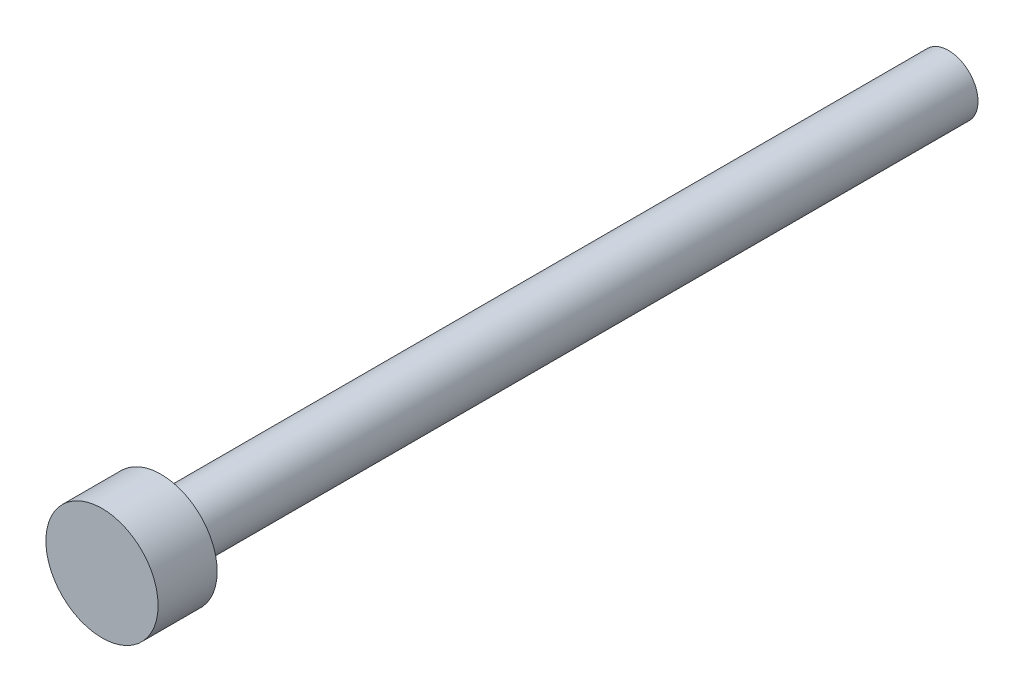
ISO-10303-21;
HEADER;
FILE_DESCRIPTION(('STEP AP214'),'2;1');
FILE_NAME('part.step','',(''),(''),'','','');
FILE_SCHEMA(('AUTOMOTIVE_DESIGN { 1 0 10303 214 1 1 1 1 }'));
ENDSEC;
DATA;
#1=APPLICATION_CONTEXT('core data for automotive mechanical design processes');
#2=APPLICATION_PROTOCOL_DEFINITION('international standard','automotive_design',2000,#1);
#3=PRODUCT_CONTEXT('',#1,'mechanical');
#4=PRODUCT('Part','Part','',(#3));
#5=PRODUCT_RELATED_PRODUCT_CATEGORY('part','',(#4));
#6=PRODUCT_DEFINITION_FORMATION('','',#4);
#7=PRODUCT_DEFINITION_CONTEXT('part definition',#1,'design');
#8=PRODUCT_DEFINITION('design','',#6,#7);
#9=PRODUCT_DEFINITION_SHAPE('','',#8);
#10=(LENGTH_UNIT() NAMED_UNIT(*) SI_UNIT(.MILLI.,.METRE.));
#11=(NAMED_UNIT(*) PLANE_ANGLE_UNIT() SI_UNIT($,.RADIAN.));
#12=(NAMED_UNIT(*) SI_UNIT($,.STERADIAN.) SOLID_ANGLE_UNIT());
#13=UNCERTAINTY_MEASURE_WITH_UNIT(LENGTH_MEASURE(1.E-05),#10,'distance_accuracy_value','');
#14=(GEOMETRIC_REPRESENTATION_CONTEXT(3) GLOBAL_UNCERTAINTY_ASSIGNED_CONTEXT((#13)) GLOBAL_UNIT_ASSIGNED_CONTEXT((#10,
#11,#12)) REPRESENTATION_CONTEXT('',''));
#15=CARTESIAN_POINT('',(0.,0.,0.));
#16=DIRECTION('',(0.,0.,1.));
#17=DIRECTION('',(1.,0.,0.));
#18=AXIS2_PLACEMENT_3D('',#15,#16,#17);
#19=CARTESIAN_POINT('',(0.,0.,40.));
#20=DIRECTION('',(0.,0.,-1.));
#21=DIRECTION('',(-1.,0.,0.));
#22=AXIS2_PLACEMENT_3D('',#19,#20,#21);
#23=CYLINDRICAL_SURFACE('',#22,1.5);
#24=CARTESIAN_POINT('',(0.,0.,40.));
#25=DIRECTION('',(0.,0.,1.));
#26=DIRECTION('',(1.,0.,0.));
#27=AXIS2_PLACEMENT_3D('',#24,#25,#26);
#28=CIRCLE('',#27,1.5);
#29=CARTESIAN_POINT('',(1.5,0.,40.));
#30=VERTEX_POINT('',#29);
#31=EDGE_CURVE('E10',#30,#30,#28,.T.);
#32=ORIENTED_EDGE('',*,*,#31,.F.);
#33=EDGE_LOOP('',(#32));
#34=FACE_BOUND('',#33,.T.);
#35=CARTESIAN_POINT('',(0.,0.,0.));
#36=DIRECTION('',(0.,0.,1.));
#37=DIRECTION('',(1.,0.,0.));
#38=AXIS2_PLACEMENT_3D('',#35,#36,#37);
#39=CIRCLE('',#38,1.5);
#40=CARTESIAN_POINT('',(1.5,0.,0.));
#41=VERTEX_POINT('',#40);
#42=EDGE_CURVE('E36',#41,#41,#39,.T.);
#43=ORIENTED_EDGE('',*,*,#42,.T.);
#44=EDGE_LOOP('',(#43));
#45=FACE_BOUND('',#44,.T.);
#46=ADVANCED_FACE('F33',(#34,#45),#23,.T.);
#47=CARTESIAN_POINT('',(0.,0.,0.));
#48=DIRECTION('',(0.,0.,1.));
#49=DIRECTION('',(1.,0.,0.));
#50=AXIS2_PLACEMENT_3D('',#47,#48,#49);
#51=PLANE('',#50);
#52=ORIENTED_EDGE('',*,*,#42,.F.);
#53=EDGE_LOOP('',(#52));
#54=FACE_BOUND('',#53,.T.);
#55=ADVANCED_FACE('F56',(#54),#51,.F.);
#56=CARTESIAN_POINT('',(0.,0.,43.));
#57=DIRECTION('',(0.,0.,-1.));
#58=DIRECTION('',(-1.,0.,0.));
#59=AXIS2_PLACEMENT_3D('',#56,#57,#58);
#60=CYLINDRICAL_SURFACE('',#59,2.85);
#61=CARTESIAN_POINT('',(0.,0.,43.));
#62=DIRECTION('',(0.,0.,1.));
#63=DIRECTION('',(1.,0.,0.));
#64=AXIS2_PLACEMENT_3D('',#61,#62,#63);
#65=CIRCLE('',#64,2.85);
#66=CARTESIAN_POINT('',(2.85,0.,43.));
#67=VERTEX_POINT('',#66);
#68=EDGE_CURVE('E43',#67,#67,#65,.T.);
#69=ORIENTED_EDGE('',*,*,#68,.F.);
#70=EDGE_LOOP('',(#69));
#71=FACE_BOUND('',#70,.T.);
#72=CARTESIAN_POINT('',(0.,0.,40.));
#73=DIRECTION('',(0.,0.,1.));
#74=DIRECTION('',(1.,0.,0.));
#75=AXIS2_PLACEMENT_3D('',#72,#73,#74);
#76=CIRCLE('',#75,2.85);
#77=CARTESIAN_POINT('',(2.85,0.,40.));
#78=VERTEX_POINT('',#77);
#79=EDGE_CURVE('E45',#78,#78,#76,.T.);
#80=ORIENTED_EDGE('',*,*,#79,.T.);
#81=EDGE_LOOP('',(#80));
#82=FACE_BOUND('',#81,.T.);
#83=ADVANCED_FACE('F53',(#71,#82),#60,.T.);
#84=CARTESIAN_POINT('',(0.,0.,43.));
#85=DIRECTION('',(0.,0.,1.));
#86=DIRECTION('',(1.,0.,0.));
#87=AXIS2_PLACEMENT_3D('',#84,#85,#86);
#88=PLANE('',#87);
#89=ORIENTED_EDGE('',*,*,#68,.T.);
#90=EDGE_LOOP('',(#89));
#91=FACE_BOUND('',#90,.T.);
#92=ADVANCED_FACE('F51',(#91),#88,.T.);
#93=CARTESIAN_POINT('',(0.,0.,40.));
#94=DIRECTION('',(0.,0.,1.));
#95=DIRECTION('',(1.,0.,0.));
#96=AXIS2_PLACEMENT_3D('',#93,#94,#95);
#97=PLANE('',#96);
#98=ORIENTED_EDGE('',*,*,#31,.T.);
#99=EDGE_LOOP('',(#98));
#100=FACE_BOUND('',#99,.T.);
#101=ORIENTED_EDGE('',*,*,#79,.F.);
#102=EDGE_LOOP('',(#101));
#103=FACE_BOUND('',#102,.T.);
#104=ADVANCED_FACE('F60',(#100,#103),#97,.F.);
#105=CLOSED_SHELL('',(#46,#55,#83,#92,#104));
#106=MANIFOLD_SOLID_BREP('B2',#105);
#107=ADVANCED_BREP_SHAPE_REPRESENTATION('',(#18,#106),#14);
#108=SHAPE_DEFINITION_REPRESENTATION(#9,#107);
ENDSEC;
END-ISO-10303-21;
